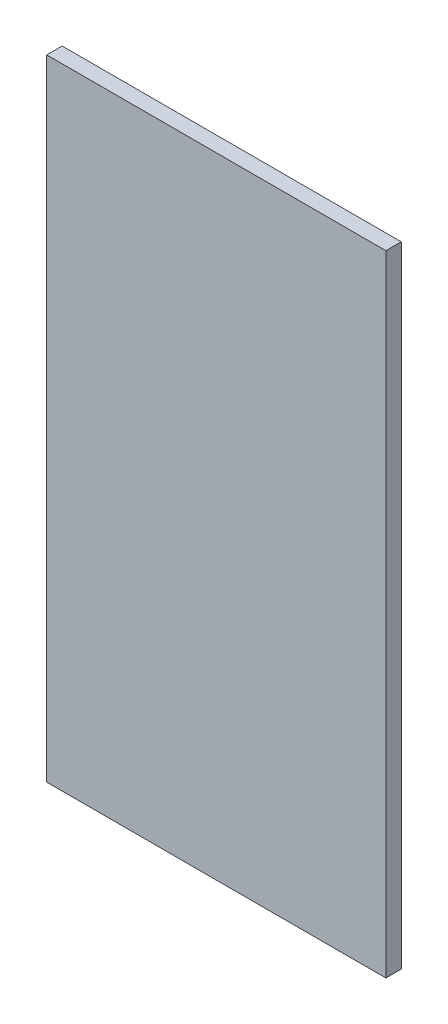
ISO-10303-21;
HEADER;
FILE_DESCRIPTION(('STEP AP214'),'2;1');
FILE_NAME('part.step','',(''),(''),'','','');
FILE_SCHEMA(('AUTOMOTIVE_DESIGN { 1 0 10303 214 1 1 1 1 }'));
ENDSEC;
DATA;
#1=APPLICATION_CONTEXT('core data for automotive mechanical design processes');
#2=APPLICATION_PROTOCOL_DEFINITION('international standard','automotive_design',2000,#1);
#3=PRODUCT_CONTEXT('',#1,'mechanical');
#4=PRODUCT('Part','Part','',(#3));
#5=PRODUCT_RELATED_PRODUCT_CATEGORY('part','',(#4));
#6=PRODUCT_DEFINITION_FORMATION('','',#4);
#7=PRODUCT_DEFINITION_CONTEXT('part definition',#1,'design');
#8=PRODUCT_DEFINITION('design','',#6,#7);
#9=PRODUCT_DEFINITION_SHAPE('','',#8);
#10=(LENGTH_UNIT() NAMED_UNIT(*) SI_UNIT(.MILLI.,.METRE.));
#11=(NAMED_UNIT(*) PLANE_ANGLE_UNIT() SI_UNIT($,.RADIAN.));
#12=(NAMED_UNIT(*) SI_UNIT($,.STERADIAN.) SOLID_ANGLE_UNIT());
#13=UNCERTAINTY_MEASURE_WITH_UNIT(LENGTH_MEASURE(1.E-05),#10,'distance_accuracy_value','');
#14=(GEOMETRIC_REPRESENTATION_CONTEXT(3) GLOBAL_UNCERTAINTY_ASSIGNED_CONTEXT((#13)) GLOBAL_UNIT_ASSIGNED_CONTEXT((#10,
#11,#12)) REPRESENTATION_CONTEXT('',''));
#15=CARTESIAN_POINT('',(0.,0.,0.));
#16=DIRECTION('',(0.,0.,1.));
#17=DIRECTION('',(1.,0.,0.));
#18=AXIS2_PLACEMENT_3D('',#15,#16,#17);
#19=CARTESIAN_POINT('',(-50.0000082570696,2.4999990188482,1.5875));
#20=DIRECTION('',(1.,0.,0.));
#21=DIRECTION('',(0.,1.,0.));
#22=AXIS2_PLACEMENT_3D('',#19,#20,#21);
#23=PLANE('',#22);
#24=DIRECTION('',(0.,-1.,0.));
#25=VECTOR('',#24,1.);
#26=CARTESIAN_POINT('',(-50.0000082570696,2.4999990188482,0.));
#27=LINE('',#26,#25);
#28=CARTESIAN_POINT('',(-50.0000082570697,67.4999990188482,0.));
#29=VERTEX_POINT('',#28);
#30=CARTESIAN_POINT('',(-50.0000082570696,2.4999990188482,0.));
#31=VERTEX_POINT('',#30);
#32=EDGE_CURVE('E129',#29,#31,#27,.T.);
#33=ORIENTED_EDGE('',*,*,#32,.T.);
#34=DIRECTION('',(0.,0.,-1.));
#35=VECTOR('',#34,1.);
#36=CARTESIAN_POINT('',(-50.0000082570696,2.4999990188482,1.5875));
#37=LINE('',#36,#35);
#38=CARTESIAN_POINT('',(-50.0000082570696,2.4999990188482,1.5875));
#39=VERTEX_POINT('',#38);
#40=EDGE_CURVE('E12',#39,#31,#37,.T.);
#41=ORIENTED_EDGE('',*,*,#40,.F.);
#42=DIRECTION('',(0.,-1.,0.));
#43=VECTOR('',#42,1.);
#44=CARTESIAN_POINT('',(-50.0000082570696,2.4999990188482,1.5875));
#45=LINE('',#44,#43);
#46=CARTESIAN_POINT('',(-50.0000082570697,67.4999990188482,1.5875));
#47=VERTEX_POINT('',#46);
#48=EDGE_CURVE('E107',#47,#39,#45,.T.);
#49=ORIENTED_EDGE('',*,*,#48,.F.);
#50=DIRECTION('',(0.,0.,-1.));
#51=VECTOR('',#50,1.);
#52=CARTESIAN_POINT('',(-50.0000082570697,67.4999990188482,1.5875));
#53=LINE('',#52,#51);
#54=EDGE_CURVE('E119',#47,#29,#53,.T.);
#55=ORIENTED_EDGE('',*,*,#54,.T.);
#56=EDGE_LOOP('',(#33,#41,#49,#55));
#57=FACE_BOUND('',#56,.T.);
#58=ADVANCED_FACE('F45',(#57),#23,.F.);
#59=CARTESIAN_POINT('',(-50.0000082570696,2.4999990188482,1.5875));
#60=DIRECTION('',(0.,1.,0.));
#61=DIRECTION('',(-1.,0.,0.));
#62=AXIS2_PLACEMENT_3D('',#59,#60,#61);
#63=PLANE('',#62);
#64=DIRECTION('',(1.,0.,0.));
#65=VECTOR('',#64,1.);
#66=CARTESIAN_POINT('',(-50.0000082570696,2.4999990188482,0.));
#67=LINE('',#66,#65);
#68=CARTESIAN_POINT('',(-15.0000082570696,2.4999990188482,0.));
#69=VERTEX_POINT('',#68);
#70=EDGE_CURVE('E112',#31,#69,#67,.T.);
#71=ORIENTED_EDGE('',*,*,#70,.T.);
#72=DIRECTION('',(0.,0.,-1.));
#73=VECTOR('',#72,1.);
#74=CARTESIAN_POINT('',(-15.0000082570696,2.4999990188482,1.5875));
#75=LINE('',#74,#73);
#76=CARTESIAN_POINT('',(-15.0000082570696,2.4999990188482,1.5875));
#77=VERTEX_POINT('',#76);
#78=EDGE_CURVE('E56',#77,#69,#75,.T.);
#79=ORIENTED_EDGE('',*,*,#78,.F.);
#80=DIRECTION('',(1.,0.,0.));
#81=VECTOR('',#80,1.);
#82=CARTESIAN_POINT('',(-50.0000082570696,2.4999990188482,1.5875));
#83=LINE('',#82,#81);
#84=EDGE_CURVE('E102',#39,#77,#83,.T.);
#85=ORIENTED_EDGE('',*,*,#84,.F.);
#86=ORIENTED_EDGE('',*,*,#40,.T.);
#87=EDGE_LOOP('',(#71,#79,#85,#86));
#88=FACE_BOUND('',#87,.T.);
#89=ADVANCED_FACE('F111',(#88),#63,.F.);
#90=CARTESIAN_POINT('',(-15.0000082570696,2.4999990188482,1.5875));
#91=DIRECTION('',(-1.,0.,0.));
#92=DIRECTION('',(0.,-1.,0.));
#93=AXIS2_PLACEMENT_3D('',#90,#91,#92);
#94=PLANE('',#93);
#95=DIRECTION('',(0.,1.,0.));
#96=VECTOR('',#95,1.);
#97=CARTESIAN_POINT('',(-15.0000082570696,2.4999990188482,0.));
#98=LINE('',#97,#96);
#99=CARTESIAN_POINT('',(-15.0000082570696,67.4999990188482,0.));
#100=VERTEX_POINT('',#99);
#101=EDGE_CURVE('E88',#69,#100,#98,.T.);
#102=ORIENTED_EDGE('',*,*,#101,.T.);
#103=DIRECTION('',(0.,0.,-1.));
#104=VECTOR('',#103,1.);
#105=CARTESIAN_POINT('',(-15.0000082570696,67.4999990188482,1.5875));
#106=LINE('',#105,#104);
#107=CARTESIAN_POINT('',(-15.0000082570696,67.4999990188482,1.5875));
#108=VERTEX_POINT('',#107);
#109=EDGE_CURVE('E114',#108,#100,#106,.T.);
#110=ORIENTED_EDGE('',*,*,#109,.F.);
#111=DIRECTION('',(0.,1.,0.));
#112=VECTOR('',#111,1.);
#113=CARTESIAN_POINT('',(-15.0000082570696,2.4999990188482,1.5875));
#114=LINE('',#113,#112);
#115=EDGE_CURVE('E105',#77,#108,#114,.T.);
#116=ORIENTED_EDGE('',*,*,#115,.F.);
#117=ORIENTED_EDGE('',*,*,#78,.T.);
#118=EDGE_LOOP('',(#102,#110,#116,#117));
#119=FACE_BOUND('',#118,.T.);
#120=ADVANCED_FACE('F115',(#119),#94,.F.);
#121=CARTESIAN_POINT('',(-50.0000082570697,67.4999990188482,1.5875));
#122=DIRECTION('',(0.,-1.,0.));
#123=DIRECTION('',(0.,0.,-1.));
#124=AXIS2_PLACEMENT_3D('',#121,#122,#123);
#125=PLANE('',#124);
#126=DIRECTION('',(-1.,0.,0.));
#127=VECTOR('',#126,1.);
#128=CARTESIAN_POINT('',(-50.0000082570697,67.4999990188482,0.));
#129=LINE('',#128,#127);
#130=EDGE_CURVE('E94',#100,#29,#129,.T.);
#131=ORIENTED_EDGE('',*,*,#130,.T.);
#132=ORIENTED_EDGE('',*,*,#54,.F.);
#133=DIRECTION('',(-1.,0.,0.));
#134=VECTOR('',#133,1.);
#135=CARTESIAN_POINT('',(-50.0000082570697,67.4999990188482,1.5875));
#136=LINE('',#135,#134);
#137=EDGE_CURVE('E67',#108,#47,#136,.T.);
#138=ORIENTED_EDGE('',*,*,#137,.F.);
#139=ORIENTED_EDGE('',*,*,#109,.T.);
#140=EDGE_LOOP('',(#131,#132,#138,#139));
#141=FACE_BOUND('',#140,.T.);
#142=ADVANCED_FACE('F166',(#141),#125,.F.);
#143=CARTESIAN_POINT('',(0.,0.,1.5875));
#144=DIRECTION('',(0.,0.,-1.));
#145=DIRECTION('',(-1.,0.,0.));
#146=AXIS2_PLACEMENT_3D('',#143,#144,#145);
#147=PLANE('',#146);
#148=ORIENTED_EDGE('',*,*,#48,.T.);
#149=ORIENTED_EDGE('',*,*,#84,.T.);
#150=ORIENTED_EDGE('',*,*,#115,.T.);
#151=ORIENTED_EDGE('',*,*,#137,.T.);
#152=EDGE_LOOP('',(#148,#149,#150,#151));
#153=FACE_BOUND('',#152,.T.);
#154=ADVANCED_FACE('F103',(#153),#147,.F.);
#155=CARTESIAN_POINT('',(0.,0.,0.));
#156=DIRECTION('',(0.,0.,-1.));
#157=DIRECTION('',(-1.,0.,0.));
#158=AXIS2_PLACEMENT_3D('',#155,#156,#157);
#159=PLANE('',#158);
#160=ORIENTED_EDGE('',*,*,#32,.F.);
#161=ORIENTED_EDGE('',*,*,#130,.F.);
#162=ORIENTED_EDGE('',*,*,#101,.F.);
#163=ORIENTED_EDGE('',*,*,#70,.F.);
#164=EDGE_LOOP('',(#160,#161,#162,#163));
#165=FACE_BOUND('',#164,.T.);
#166=ADVANCED_FACE('F160',(#165),#159,.T.);
#167=CLOSED_SHELL('',(#58,#89,#120,#142,#154,#166));
#168=MANIFOLD_SOLID_BREP('B2',#167);
#169=ADVANCED_BREP_SHAPE_REPRESENTATION('',(#18,#168),#14);
#170=SHAPE_DEFINITION_REPRESENTATION(#9,#169);
ENDSEC;
END-ISO-10303-21;
